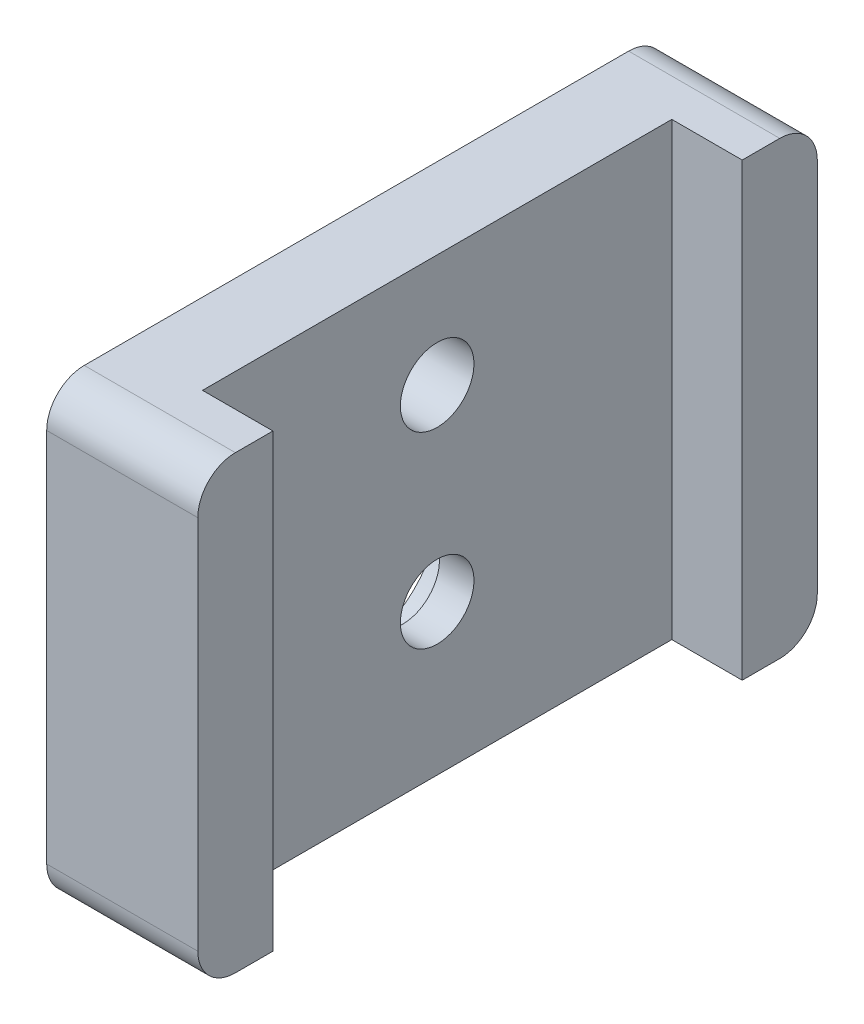
ISO-10303-21;
HEADER;
FILE_DESCRIPTION(('STEP AP214'),'2;1');
FILE_NAME('part.step','',(''),(''),'','','');
FILE_SCHEMA(('AUTOMOTIVE_DESIGN { 1 0 10303 214 1 1 1 1 }'));
ENDSEC;
DATA;
#1=APPLICATION_CONTEXT('core data for automotive mechanical design processes');
#2=APPLICATION_PROTOCOL_DEFINITION('international standard','automotive_design',2000,#1);
#3=PRODUCT_CONTEXT('',#1,'mechanical');
#4=PRODUCT('Part','Part','',(#3));
#5=PRODUCT_RELATED_PRODUCT_CATEGORY('part','',(#4));
#6=PRODUCT_DEFINITION_FORMATION('','',#4);
#7=PRODUCT_DEFINITION_CONTEXT('part definition',#1,'design');
#8=PRODUCT_DEFINITION('design','',#6,#7);
#9=PRODUCT_DEFINITION_SHAPE('','',#8);
#10=(LENGTH_UNIT() NAMED_UNIT(*) SI_UNIT(.MILLI.,.METRE.));
#11=(NAMED_UNIT(*) PLANE_ANGLE_UNIT() SI_UNIT($,.RADIAN.));
#12=(NAMED_UNIT(*) SI_UNIT($,.STERADIAN.) SOLID_ANGLE_UNIT());
#13=UNCERTAINTY_MEASURE_WITH_UNIT(LENGTH_MEASURE(1.E-05),#10,'distance_accuracy_value','');
#14=(GEOMETRIC_REPRESENTATION_CONTEXT(3) GLOBAL_UNCERTAINTY_ASSIGNED_CONTEXT((#13)) GLOBAL_UNIT_ASSIGNED_CONTEXT((#10,
#11,#12)) REPRESENTATION_CONTEXT('',''));
#15=CARTESIAN_POINT('',(0.,0.,0.));
#16=DIRECTION('',(0.,0.,1.));
#17=DIRECTION('',(1.,0.,0.));
#18=AXIS2_PLACEMENT_3D('',#15,#16,#17);
#19=CARTESIAN_POINT('',(5.461,0.,0.));
#20=DIRECTION('',(1.,0.,0.));
#21=DIRECTION('',(0.,0.,-1.));
#22=AXIS2_PLACEMENT_3D('',#19,#20,#21);
#23=PLANE('',#22);
#24=CARTESIAN_POINT('',(5.461,-5.08,0.));
#25=DIRECTION('',(-1.,0.,0.));
#26=DIRECTION('',(0.,0.,1.));
#27=AXIS2_PLACEMENT_3D('',#24,#25,#26);
#28=CIRCLE('',#27,2.4892);
#29=CARTESIAN_POINT('',(5.461,-5.08,2.4892));
#30=VERTEX_POINT('',#29);
#31=EDGE_CURVE('E182',#30,#30,#28,.T.);
#32=ORIENTED_EDGE('',*,*,#31,.T.);
#33=EDGE_LOOP('',(#32));
#34=FACE_BOUND('',#33,.T.);
#35=CARTESIAN_POINT('',(5.461,7.62,0.));
#36=DIRECTION('',(-1.,0.,0.));
#37=DIRECTION('',(0.,0.,1.));
#38=AXIS2_PLACEMENT_3D('',#35,#36,#37);
#39=CIRCLE('',#38,2.4892);
#40=CARTESIAN_POINT('',(5.461,7.62,2.4892));
#41=VERTEX_POINT('',#40);
#42=EDGE_CURVE('E188',#41,#41,#39,.T.);
#43=ORIENTED_EDGE('',*,*,#42,.T.);
#44=EDGE_LOOP('',(#43));
#45=FACE_BOUND('',#44,.T.);
#46=DIRECTION('',(0.,0.,-1.));
#47=VECTOR('',#46,1.);
#48=CARTESIAN_POINT('',(5.461,-15.24,20.955));
#49=LINE('',#48,#47);
#50=CARTESIAN_POINT('',(5.461,-15.24,15.875));
#51=VERTEX_POINT('',#50);
#52=CARTESIAN_POINT('',(5.461,-15.24,-15.875));
#53=VERTEX_POINT('',#52);
#54=EDGE_CURVE('E194',#51,#53,#49,.T.);
#55=ORIENTED_EDGE('',*,*,#54,.T.);
#56=DIRECTION('',(0.,-1.,0.));
#57=VECTOR('',#56,1.);
#58=CARTESIAN_POINT('',(5.461,15.24,-15.875));
#59=LINE('',#58,#57);
#60=CARTESIAN_POINT('',(5.461,15.24,-15.875));
#61=VERTEX_POINT('',#60);
#62=EDGE_CURVE('E147',#61,#53,#59,.T.);
#63=ORIENTED_EDGE('',*,*,#62,.F.);
#64=DIRECTION('',(0.,0.,1.));
#65=VECTOR('',#64,1.);
#66=CARTESIAN_POINT('',(5.461,15.24,-20.955));
#67=LINE('',#66,#65);
#68=CARTESIAN_POINT('',(5.461,15.24,15.875));
#69=VERTEX_POINT('',#68);
#70=EDGE_CURVE('E192',#61,#69,#67,.T.);
#71=ORIENTED_EDGE('',*,*,#70,.T.);
#72=DIRECTION('',(0.,1.,0.));
#73=VECTOR('',#72,1.);
#74=CARTESIAN_POINT('',(5.461,15.24,15.875));
#75=LINE('',#74,#73);
#76=EDGE_CURVE('E151',#51,#69,#75,.T.);
#77=ORIENTED_EDGE('',*,*,#76,.F.);
#78=EDGE_LOOP('',(#55,#63,#71,#77));
#79=FACE_BOUND('',#78,.T.);
#80=ADVANCED_FACE('F35',(#34,#45,#79),#23,.T.);
#81=CARTESIAN_POINT('',(5.461,15.24,15.875));
#82=DIRECTION('',(0.,-1.,0.));
#83=DIRECTION('',(0.,0.,-1.));
#84=AXIS2_PLACEMENT_3D('',#81,#82,#83);
#85=PLANE('',#84);
#86=DIRECTION('',(0.,0.,1.));
#87=VECTOR('',#86,1.);
#88=CARTESIAN_POINT('',(10.2235,15.24,-15.875));
#89=LINE('',#88,#87);
#90=CARTESIAN_POINT('',(10.2235,15.24,-18.415));
#91=VERTEX_POINT('',#90);
#92=CARTESIAN_POINT('',(10.2235,15.24,-15.875));
#93=VERTEX_POINT('',#92);
#94=EDGE_CURVE('E143',#91,#93,#89,.T.);
#95=ORIENTED_EDGE('',*,*,#94,.F.);
#96=DIRECTION('',(-1.,0.,0.));
#97=VECTOR('',#96,1.);
#98=CARTESIAN_POINT('',(5.461,15.24,-18.415));
#99=LINE('',#98,#97);
#100=CARTESIAN_POINT('',(0.,15.24,-18.415));
#101=VERTEX_POINT('',#100);
#102=EDGE_CURVE('E207',#91,#101,#99,.T.);
#103=ORIENTED_EDGE('',*,*,#102,.T.);
#104=DIRECTION('',(0.,0.,1.));
#105=VECTOR('',#104,1.);
#106=CARTESIAN_POINT('',(0.,15.24,15.875));
#107=LINE('',#106,#105);
#108=CARTESIAN_POINT('',(0.,15.24,18.415));
#109=VERTEX_POINT('',#108);
#110=EDGE_CURVE('E191',#101,#109,#107,.T.);
#111=ORIENTED_EDGE('',*,*,#110,.T.);
#112=DIRECTION('',(-1.,0.,0.));
#113=VECTOR('',#112,1.);
#114=CARTESIAN_POINT('',(5.461,15.24,18.415));
#115=LINE('',#114,#113);
#116=CARTESIAN_POINT('',(10.2235,15.24,18.415));
#117=VERTEX_POINT('',#116);
#118=EDGE_CURVE('E197',#109,#117,#115,.F.);
#119=ORIENTED_EDGE('',*,*,#118,.T.);
#120=DIRECTION('',(0.,0.,1.));
#121=VECTOR('',#120,1.);
#122=CARTESIAN_POINT('',(10.2235,15.24,20.955));
#123=LINE('',#122,#121);
#124=CARTESIAN_POINT('',(10.2235,15.24,15.875));
#125=VERTEX_POINT('',#124);
#126=EDGE_CURVE('E165',#125,#117,#123,.T.);
#127=ORIENTED_EDGE('',*,*,#126,.F.);
#128=DIRECTION('',(-1.,0.,0.));
#129=VECTOR('',#128,1.);
#130=CARTESIAN_POINT('',(10.2235,15.24,15.875));
#131=LINE('',#130,#129);
#132=EDGE_CURVE('E166',#125,#69,#131,.T.);
#133=ORIENTED_EDGE('',*,*,#132,.T.);
#134=ORIENTED_EDGE('',*,*,#70,.F.);
#135=DIRECTION('',(-1.,0.,0.));
#136=VECTOR('',#135,1.);
#137=CARTESIAN_POINT('',(10.2235,15.24,-15.875));
#138=LINE('',#137,#136);
#139=EDGE_CURVE('E152',#93,#61,#138,.T.);
#140=ORIENTED_EDGE('',*,*,#139,.F.);
#141=EDGE_LOOP('',(#95,#103,#111,#119,#127,#133,#134,#140));
#142=FACE_BOUND('',#141,.T.);
#143=ADVANCED_FACE('F255',(#142),#85,.F.);
#144=CARTESIAN_POINT('',(5.461,15.24,20.955));
#145=DIRECTION('',(0.,0.,-1.));
#146=DIRECTION('',(0.,1.,0.));
#147=AXIS2_PLACEMENT_3D('',#144,#145,#146);
#148=PLANE('',#147);
#149=DIRECTION('',(0.,-1.,0.));
#150=VECTOR('',#149,1.);
#151=CARTESIAN_POINT('',(0.,15.24,20.955));
#152=LINE('',#151,#150);
#153=CARTESIAN_POINT('',(0.,12.7,20.955));
#154=VERTEX_POINT('',#153);
#155=CARTESIAN_POINT('',(0.,-12.7,20.955));
#156=VERTEX_POINT('',#155);
#157=EDGE_CURVE('E200',#154,#156,#152,.T.);
#158=ORIENTED_EDGE('',*,*,#157,.T.);
#159=DIRECTION('',(-1.,0.,0.));
#160=VECTOR('',#159,1.);
#161=CARTESIAN_POINT('',(5.461,-12.7,20.955));
#162=LINE('',#161,#160);
#163=CARTESIAN_POINT('',(10.2235,-12.7,20.955));
#164=VERTEX_POINT('',#163);
#165=EDGE_CURVE('E50',#156,#164,#162,.F.);
#166=ORIENTED_EDGE('',*,*,#165,.T.);
#167=DIRECTION('',(0.,-1.,0.));
#168=VECTOR('',#167,1.);
#169=CARTESIAN_POINT('',(10.2235,15.24,20.955));
#170=LINE('',#169,#168);
#171=CARTESIAN_POINT('',(10.2235,12.7,20.955));
#172=VERTEX_POINT('',#171);
#173=EDGE_CURVE('E155',#172,#164,#170,.T.);
#174=ORIENTED_EDGE('',*,*,#173,.F.);
#175=DIRECTION('',(-1.,0.,0.));
#176=VECTOR('',#175,1.);
#177=CARTESIAN_POINT('',(5.461,12.7,20.955));
#178=LINE('',#177,#176);
#179=EDGE_CURVE('E231',#172,#154,#178,.T.);
#180=ORIENTED_EDGE('',*,*,#179,.T.);
#181=EDGE_LOOP('',(#158,#166,#174,#180));
#182=FACE_BOUND('',#181,.T.);
#183=ADVANCED_FACE('F236',(#182),#148,.F.);
#184=CARTESIAN_POINT('',(5.461,-15.24,-15.875));
#185=DIRECTION('',(0.,1.,0.));
#186=DIRECTION('',(0.,0.,1.));
#187=AXIS2_PLACEMENT_3D('',#184,#185,#186);
#188=PLANE('',#187);
#189=DIRECTION('',(0.,0.,-1.));
#190=VECTOR('',#189,1.);
#191=CARTESIAN_POINT('',(0.,-15.24,-15.875));
#192=LINE('',#191,#190);
#193=CARTESIAN_POINT('',(0.,-15.24,18.415));
#194=VERTEX_POINT('',#193);
#195=CARTESIAN_POINT('',(0.,-15.24,-18.415));
#196=VERTEX_POINT('',#195);
#197=EDGE_CURVE('E202',#194,#196,#192,.T.);
#198=ORIENTED_EDGE('',*,*,#197,.T.);
#199=DIRECTION('',(-1.,0.,0.));
#200=VECTOR('',#199,1.);
#201=CARTESIAN_POINT('',(5.461,-15.24,-18.415));
#202=LINE('',#201,#200);
#203=CARTESIAN_POINT('',(10.2235,-15.24,-18.415));
#204=VERTEX_POINT('',#203);
#205=EDGE_CURVE('E133',#196,#204,#202,.F.);
#206=ORIENTED_EDGE('',*,*,#205,.T.);
#207=DIRECTION('',(0.,0.,-1.));
#208=VECTOR('',#207,1.);
#209=CARTESIAN_POINT('',(10.2235,-15.24,-15.875));
#210=LINE('',#209,#208);
#211=CARTESIAN_POINT('',(10.2235,-15.24,-15.875));
#212=VERTEX_POINT('',#211);
#213=EDGE_CURVE('E124',#212,#204,#210,.T.);
#214=ORIENTED_EDGE('',*,*,#213,.F.);
#215=DIRECTION('',(-1.,0.,0.));
#216=VECTOR('',#215,1.);
#217=CARTESIAN_POINT('',(10.2235,-15.24,-15.875));
#218=LINE('',#217,#216);
#219=EDGE_CURVE('E130',#212,#53,#218,.T.);
#220=ORIENTED_EDGE('',*,*,#219,.T.);
#221=ORIENTED_EDGE('',*,*,#54,.F.);
#222=DIRECTION('',(-1.,0.,0.));
#223=VECTOR('',#222,1.);
#224=CARTESIAN_POINT('',(10.2235,-15.24,15.875));
#225=LINE('',#224,#223);
#226=CARTESIAN_POINT('',(10.2235,-15.24,15.875));
#227=VERTEX_POINT('',#226);
#228=EDGE_CURVE('E170',#227,#51,#225,.T.);
#229=ORIENTED_EDGE('',*,*,#228,.F.);
#230=DIRECTION('',(0.,0.,-1.));
#231=VECTOR('',#230,1.);
#232=CARTESIAN_POINT('',(10.2235,-15.24,20.955));
#233=LINE('',#232,#231);
#234=CARTESIAN_POINT('',(10.2235,-15.24,18.415));
#235=VERTEX_POINT('',#234);
#236=EDGE_CURVE('E161',#235,#227,#233,.T.);
#237=ORIENTED_EDGE('',*,*,#236,.F.);
#238=DIRECTION('',(-1.,0.,0.));
#239=VECTOR('',#238,1.);
#240=CARTESIAN_POINT('',(5.461,-15.24,18.415));
#241=LINE('',#240,#239);
#242=EDGE_CURVE('E227',#235,#194,#241,.T.);
#243=ORIENTED_EDGE('',*,*,#242,.T.);
#244=EDGE_LOOP('',(#198,#206,#214,#220,#221,#229,#237,#243));
#245=FACE_BOUND('',#244,.T.);
#246=ADVANCED_FACE('F127',(#245),#188,.F.);
#247=CARTESIAN_POINT('',(5.461,-15.24,-20.955));
#248=DIRECTION('',(0.,0.,1.));
#249=DIRECTION('',(0.,-1.,0.));
#250=AXIS2_PLACEMENT_3D('',#247,#248,#249);
#251=PLANE('',#250);
#252=DIRECTION('',(0.,1.,0.));
#253=VECTOR('',#252,1.);
#254=CARTESIAN_POINT('',(0.,-15.24,-20.955));
#255=LINE('',#254,#253);
#256=CARTESIAN_POINT('',(0.,-12.7,-20.955));
#257=VERTEX_POINT('',#256);
#258=CARTESIAN_POINT('',(0.,12.7,-20.955));
#259=VERTEX_POINT('',#258);
#260=EDGE_CURVE('E195',#257,#259,#255,.T.);
#261=ORIENTED_EDGE('',*,*,#260,.T.);
#262=DIRECTION('',(-1.,0.,0.));
#263=VECTOR('',#262,1.);
#264=CARTESIAN_POINT('',(5.461,12.7,-20.955));
#265=LINE('',#264,#263);
#266=CARTESIAN_POINT('',(10.2235,12.7,-20.955));
#267=VERTEX_POINT('',#266);
#268=EDGE_CURVE('E221',#259,#267,#265,.F.);
#269=ORIENTED_EDGE('',*,*,#268,.T.);
#270=DIRECTION('',(0.,1.,0.));
#271=VECTOR('',#270,1.);
#272=CARTESIAN_POINT('',(10.2235,15.24,-20.955));
#273=LINE('',#272,#271);
#274=CARTESIAN_POINT('',(10.2235,-12.7,-20.955));
#275=VERTEX_POINT('',#274);
#276=EDGE_CURVE('E136',#275,#267,#273,.T.);
#277=ORIENTED_EDGE('',*,*,#276,.F.);
#278=DIRECTION('',(-1.,0.,0.));
#279=VECTOR('',#278,1.);
#280=CARTESIAN_POINT('',(5.461,-12.7,-20.955));
#281=LINE('',#280,#279);
#282=EDGE_CURVE('E218',#275,#257,#281,.T.);
#283=ORIENTED_EDGE('',*,*,#282,.T.);
#284=EDGE_LOOP('',(#261,#269,#277,#283));
#285=FACE_BOUND('',#284,.T.);
#286=ADVANCED_FACE('F276',(#285),#251,.F.);
#287=CARTESIAN_POINT('',(0.,0.,0.));
#288=DIRECTION('',(1.,0.,0.));
#289=DIRECTION('',(0.,0.,-1.));
#290=AXIS2_PLACEMENT_3D('',#287,#288,#289);
#291=PLANE('',#290);
#292=CARTESIAN_POINT('',(0.,-5.08,0.));
#293=DIRECTION('',(-1.,0.,0.));
#294=DIRECTION('',(0.,0.,1.));
#295=AXIS2_PLACEMENT_3D('',#292,#293,#294);
#296=CIRCLE('',#295,5.55625);
#297=CARTESIAN_POINT('',(0.,-5.08,5.55624999999999));
#298=VERTEX_POINT('',#297);
#299=EDGE_CURVE('E173',#298,#298,#296,.T.);
#300=ORIENTED_EDGE('',*,*,#299,.F.);
#301=EDGE_LOOP('',(#300));
#302=FACE_BOUND('',#301,.T.);
#303=CARTESIAN_POINT('',(0.,7.62,0.));
#304=DIRECTION('',(-1.,0.,0.));
#305=DIRECTION('',(0.,0.,1.));
#306=AXIS2_PLACEMENT_3D('',#303,#304,#305);
#307=CIRCLE('',#306,2.48919999999999);
#308=CARTESIAN_POINT('',(0.,7.62,2.48919999999999));
#309=VERTEX_POINT('',#308);
#310=EDGE_CURVE('E185',#309,#309,#307,.T.);
#311=ORIENTED_EDGE('',*,*,#310,.F.);
#312=EDGE_LOOP('',(#311));
#313=FACE_BOUND('',#312,.T.);
#314=ORIENTED_EDGE('',*,*,#110,.F.);
#315=CARTESIAN_POINT('',(0.,12.7,-18.415));
#316=DIRECTION('',(1.,0.,0.));
#317=DIRECTION('',(0.,0.,-1.));
#318=AXIS2_PLACEMENT_3D('',#315,#316,#317);
#319=CIRCLE('',#318,2.54);
#320=EDGE_CURVE('E216',#101,#259,#319,.F.);
#321=ORIENTED_EDGE('',*,*,#320,.T.);
#322=ORIENTED_EDGE('',*,*,#260,.F.);
#323=CARTESIAN_POINT('',(0.,-12.7,-18.415));
#324=DIRECTION('',(1.,0.,0.));
#325=DIRECTION('',(0.,0.,-1.));
#326=AXIS2_PLACEMENT_3D('',#323,#324,#325);
#327=CIRCLE('',#326,2.54);
#328=EDGE_CURVE('E214',#257,#196,#327,.F.);
#329=ORIENTED_EDGE('',*,*,#328,.T.);
#330=ORIENTED_EDGE('',*,*,#197,.F.);
#331=CARTESIAN_POINT('',(0.,-12.7,18.415));
#332=DIRECTION('',(1.,0.,0.));
#333=DIRECTION('',(0.,0.,-1.));
#334=AXIS2_PLACEMENT_3D('',#331,#332,#333);
#335=CIRCLE('',#334,2.54);
#336=EDGE_CURVE('E212',#194,#156,#335,.F.);
#337=ORIENTED_EDGE('',*,*,#336,.T.);
#338=ORIENTED_EDGE('',*,*,#157,.F.);
#339=CARTESIAN_POINT('',(0.,12.7,18.415));
#340=DIRECTION('',(1.,0.,0.));
#341=DIRECTION('',(0.,0.,-1.));
#342=AXIS2_PLACEMENT_3D('',#339,#340,#341);
#343=CIRCLE('',#342,2.54);
#344=EDGE_CURVE('E210',#154,#109,#343,.F.);
#345=ORIENTED_EDGE('',*,*,#344,.T.);
#346=EDGE_LOOP('',(#314,#321,#322,#329,#330,#337,#338,#345));
#347=FACE_BOUND('',#346,.T.);
#348=ADVANCED_FACE('F240',(#302,#313,#347),#291,.F.);
#349=CARTESIAN_POINT('',(0.,7.62,0.));
#350=DIRECTION('',(-1.,0.,0.));
#351=DIRECTION('',(0.,0.,1.));
#352=AXIS2_PLACEMENT_3D('',#349,#350,#351);
#353=CYLINDRICAL_SURFACE('',#352,2.48919999999999);
#354=ORIENTED_EDGE('',*,*,#42,.F.);
#355=EDGE_LOOP('',(#354));
#356=FACE_BOUND('',#355,.T.);
#357=ORIENTED_EDGE('',*,*,#310,.T.);
#358=EDGE_LOOP('',(#357));
#359=FACE_BOUND('',#358,.T.);
#360=ADVANCED_FACE('F272',(#356,#359),#353,.F.);
#361=CARTESIAN_POINT('',(0.,-5.08,0.));
#362=DIRECTION('',(-1.,0.,0.));
#363=DIRECTION('',(0.,0.,1.));
#364=AXIS2_PLACEMENT_3D('',#361,#362,#363);
#365=CYLINDRICAL_SURFACE('',#364,2.4892);
#366=ORIENTED_EDGE('',*,*,#31,.F.);
#367=EDGE_LOOP('',(#366));
#368=FACE_BOUND('',#367,.T.);
#369=CARTESIAN_POINT('',(3.1242,-5.08,0.));
#370=DIRECTION('',(-1.,0.,0.));
#371=DIRECTION('',(0.,0.,1.));
#372=AXIS2_PLACEMENT_3D('',#369,#370,#371);
#373=CIRCLE('',#372,2.4892);
#374=CARTESIAN_POINT('',(3.1242,-5.08,2.4892));
#375=VERTEX_POINT('',#374);
#376=EDGE_CURVE('E179',#375,#375,#373,.T.);
#377=ORIENTED_EDGE('',*,*,#376,.T.);
#378=EDGE_LOOP('',(#377));
#379=FACE_BOUND('',#378,.T.);
#380=ADVANCED_FACE('F410',(#368,#379),#365,.F.);
#381=CARTESIAN_POINT('',(3.1242,-2.5908,0.));
#382=DIRECTION('',(1.,0.,0.));
#383=DIRECTION('',(0.,0.,-1.));
#384=AXIS2_PLACEMENT_3D('',#381,#382,#383);
#385=PLANE('',#384);
#386=ORIENTED_EDGE('',*,*,#376,.F.);
#387=EDGE_LOOP('',(#386));
#388=FACE_BOUND('',#387,.T.);
#389=CARTESIAN_POINT('',(3.1242,-5.08,0.));
#390=DIRECTION('',(-1.,0.,0.));
#391=DIRECTION('',(0.,0.,1.));
#392=AXIS2_PLACEMENT_3D('',#389,#390,#391);
#393=CIRCLE('',#392,5.55625);
#394=CARTESIAN_POINT('',(3.1242,-5.08,5.55625));
#395=VERTEX_POINT('',#394);
#396=EDGE_CURVE('E176',#395,#395,#393,.T.);
#397=ORIENTED_EDGE('',*,*,#396,.T.);
#398=EDGE_LOOP('',(#397));
#399=FACE_BOUND('',#398,.T.);
#400=ADVANCED_FACE('F401',(#388,#399),#385,.F.);
#401=CARTESIAN_POINT('',(0.,-5.08,0.));
#402=DIRECTION('',(-1.,0.,0.));
#403=DIRECTION('',(0.,0.,1.));
#404=AXIS2_PLACEMENT_3D('',#401,#402,#403);
#405=CYLINDRICAL_SURFACE('',#404,5.55625);
#406=ORIENTED_EDGE('',*,*,#396,.F.);
#407=EDGE_LOOP('',(#406));
#408=FACE_BOUND('',#407,.T.);
#409=ORIENTED_EDGE('',*,*,#299,.T.);
#410=EDGE_LOOP('',(#409));
#411=FACE_BOUND('',#410,.T.);
#412=ADVANCED_FACE('F351',(#408,#411),#405,.F.);
#413=CARTESIAN_POINT('',(10.2235,15.24,15.875));
#414=DIRECTION('',(0.,0.,1.));
#415=DIRECTION('',(0.,-1.,0.));
#416=AXIS2_PLACEMENT_3D('',#413,#414,#415);
#417=PLANE('',#416);
#418=ORIENTED_EDGE('',*,*,#76,.T.);
#419=ORIENTED_EDGE('',*,*,#132,.F.);
#420=DIRECTION('',(0.,1.,0.));
#421=VECTOR('',#420,1.);
#422=CARTESIAN_POINT('',(10.2235,15.24,15.875));
#423=LINE('',#422,#421);
#424=EDGE_CURVE('E163',#227,#125,#423,.T.);
#425=ORIENTED_EDGE('',*,*,#424,.F.);
#426=ORIENTED_EDGE('',*,*,#228,.T.);
#427=EDGE_LOOP('',(#418,#419,#425,#426));
#428=FACE_BOUND('',#427,.T.);
#429=ADVANCED_FACE('F253',(#428),#417,.F.);
#430=CARTESIAN_POINT('',(10.2235,0.,0.));
#431=DIRECTION('',(1.,0.,0.));
#432=DIRECTION('',(0.,0.,-1.));
#433=AXIS2_PLACEMENT_3D('',#430,#431,#432);
#434=PLANE('',#433);
#435=ORIENTED_EDGE('',*,*,#173,.T.);
#436=CARTESIAN_POINT('',(10.2235,-12.7,18.415));
#437=DIRECTION('',(1.,0.,0.));
#438=DIRECTION('',(0.,0.,-1.));
#439=AXIS2_PLACEMENT_3D('',#436,#437,#438);
#440=CIRCLE('',#439,2.54);
#441=EDGE_CURVE('E11',#164,#235,#440,.T.);
#442=ORIENTED_EDGE('',*,*,#441,.T.);
#443=ORIENTED_EDGE('',*,*,#236,.T.);
#444=ORIENTED_EDGE('',*,*,#424,.T.);
#445=ORIENTED_EDGE('',*,*,#126,.T.);
#446=CARTESIAN_POINT('',(10.2235,12.7,18.415));
#447=DIRECTION('',(1.,0.,0.));
#448=DIRECTION('',(0.,0.,-1.));
#449=AXIS2_PLACEMENT_3D('',#446,#447,#448);
#450=CIRCLE('',#449,2.54);
#451=EDGE_CURVE('E43',#117,#172,#450,.T.);
#452=ORIENTED_EDGE('',*,*,#451,.T.);
#453=EDGE_LOOP('',(#435,#442,#443,#444,#445,#452));
#454=FACE_BOUND('',#453,.T.);
#455=ADVANCED_FACE('F249',(#454),#434,.T.);
#456=CARTESIAN_POINT('',(10.2235,15.24,-15.875));
#457=DIRECTION('',(0.,0.,-1.));
#458=DIRECTION('',(0.,1.,0.));
#459=AXIS2_PLACEMENT_3D('',#456,#457,#458);
#460=PLANE('',#459);
#461=ORIENTED_EDGE('',*,*,#62,.T.);
#462=ORIENTED_EDGE('',*,*,#219,.F.);
#463=DIRECTION('',(0.,-1.,0.));
#464=VECTOR('',#463,1.);
#465=CARTESIAN_POINT('',(10.2235,15.24,-15.875));
#466=LINE('',#465,#464);
#467=EDGE_CURVE('E137',#93,#212,#466,.T.);
#468=ORIENTED_EDGE('',*,*,#467,.F.);
#469=ORIENTED_EDGE('',*,*,#139,.T.);
#470=EDGE_LOOP('',(#461,#462,#468,#469));
#471=FACE_BOUND('',#470,.T.);
#472=ADVANCED_FACE('F149',(#471),#460,.F.);
#473=CARTESIAN_POINT('',(10.2235,0.,0.));
#474=DIRECTION('',(1.,0.,0.));
#475=DIRECTION('',(0.,0.,-1.));
#476=AXIS2_PLACEMENT_3D('',#473,#474,#475);
#477=PLANE('',#476);
#478=ORIENTED_EDGE('',*,*,#276,.T.);
#479=CARTESIAN_POINT('',(10.2235,12.7,-18.415));
#480=DIRECTION('',(1.,0.,0.));
#481=DIRECTION('',(0.,0.,-1.));
#482=AXIS2_PLACEMENT_3D('',#479,#480,#481);
#483=CIRCLE('',#482,2.54);
#484=EDGE_CURVE('E225',#267,#91,#483,.T.);
#485=ORIENTED_EDGE('',*,*,#484,.T.);
#486=ORIENTED_EDGE('',*,*,#94,.T.);
#487=ORIENTED_EDGE('',*,*,#467,.T.);
#488=ORIENTED_EDGE('',*,*,#213,.T.);
#489=CARTESIAN_POINT('',(10.2235,-12.7,-18.415));
#490=DIRECTION('',(1.,0.,0.));
#491=DIRECTION('',(0.,0.,-1.));
#492=AXIS2_PLACEMENT_3D('',#489,#490,#491);
#493=CIRCLE('',#492,2.54);
#494=EDGE_CURVE('E223',#204,#275,#493,.T.);
#495=ORIENTED_EDGE('',*,*,#494,.T.);
#496=EDGE_LOOP('',(#478,#485,#486,#487,#488,#495));
#497=FACE_BOUND('',#496,.T.);
#498=ADVANCED_FACE('F141',(#497),#477,.T.);
#499=CARTESIAN_POINT('',(5.461,12.7,-18.415));
#500=DIRECTION('',(-1.,0.,0.));
#501=DIRECTION('',(0.,0.,1.));
#502=AXIS2_PLACEMENT_3D('',#499,#500,#501);
#503=CYLINDRICAL_SURFACE('',#502,2.54);
#504=ORIENTED_EDGE('',*,*,#484,.F.);
#505=ORIENTED_EDGE('',*,*,#268,.F.);
#506=ORIENTED_EDGE('',*,*,#320,.F.);
#507=ORIENTED_EDGE('',*,*,#102,.F.);
#508=EDGE_LOOP('',(#504,#505,#506,#507));
#509=FACE_BOUND('',#508,.T.);
#510=ADVANCED_FACE('F285',(#509),#503,.T.);
#511=CARTESIAN_POINT('',(5.461,-12.7,-18.415));
#512=DIRECTION('',(-1.,0.,0.));
#513=DIRECTION('',(0.,0.,1.));
#514=AXIS2_PLACEMENT_3D('',#511,#512,#513);
#515=CYLINDRICAL_SURFACE('',#514,2.54);
#516=ORIENTED_EDGE('',*,*,#494,.F.);
#517=ORIENTED_EDGE('',*,*,#205,.F.);
#518=ORIENTED_EDGE('',*,*,#328,.F.);
#519=ORIENTED_EDGE('',*,*,#282,.F.);
#520=EDGE_LOOP('',(#516,#517,#518,#519));
#521=FACE_BOUND('',#520,.T.);
#522=ADVANCED_FACE('F261',(#521),#515,.T.);
#523=CARTESIAN_POINT('',(5.461,-12.7,18.415));
#524=DIRECTION('',(-1.,0.,0.));
#525=DIRECTION('',(0.,0.,1.));
#526=AXIS2_PLACEMENT_3D('',#523,#524,#525);
#527=CYLINDRICAL_SURFACE('',#526,2.54);
#528=ORIENTED_EDGE('',*,*,#441,.F.);
#529=ORIENTED_EDGE('',*,*,#165,.F.);
#530=ORIENTED_EDGE('',*,*,#336,.F.);
#531=ORIENTED_EDGE('',*,*,#242,.F.);
#532=EDGE_LOOP('',(#528,#529,#530,#531));
#533=FACE_BOUND('',#532,.T.);
#534=ADVANCED_FACE('F245',(#533),#527,.T.);
#535=CARTESIAN_POINT('',(5.461,12.7,18.415));
#536=DIRECTION('',(-1.,0.,0.));
#537=DIRECTION('',(0.,0.,1.));
#538=AXIS2_PLACEMENT_3D('',#535,#536,#537);
#539=CYLINDRICAL_SURFACE('',#538,2.54);
#540=ORIENTED_EDGE('',*,*,#451,.F.);
#541=ORIENTED_EDGE('',*,*,#118,.F.);
#542=ORIENTED_EDGE('',*,*,#344,.F.);
#543=ORIENTED_EDGE('',*,*,#179,.F.);
#544=EDGE_LOOP('',(#540,#541,#542,#543));
#545=FACE_BOUND('',#544,.T.);
#546=ADVANCED_FACE('F37',(#545),#539,.T.);
#547=CLOSED_SHELL('',(#80,#143,#183,#246,#286,#348,#360,#380,#400,#412,#429,#455,#472,#498,#510,
#522,#534,#546));
#548=MANIFOLD_SOLID_BREP('B2',#547);
#549=ADVANCED_BREP_SHAPE_REPRESENTATION('',(#18,#548),#14);
#550=SHAPE_DEFINITION_REPRESENTATION(#9,#549);
ENDSEC;
END-ISO-10303-21;
